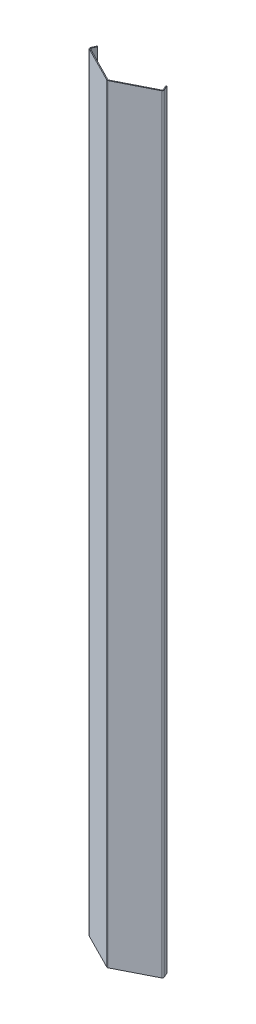
ISO-10303-21;
HEADER;
FILE_DESCRIPTION(('STEP AP214'),'2;1');
FILE_NAME('part.step','',(''),(''),'','','');
FILE_SCHEMA(('AUTOMOTIVE_DESIGN { 1 0 10303 214 1 1 1 1 }'));
ENDSEC;
DATA;
#1=APPLICATION_CONTEXT('core data for automotive mechanical design processes');
#2=APPLICATION_PROTOCOL_DEFINITION('international standard','automotive_design',2000,#1);
#3=PRODUCT_CONTEXT('',#1,'mechanical');
#4=PRODUCT('Part','Part','',(#3));
#5=PRODUCT_RELATED_PRODUCT_CATEGORY('part','',(#4));
#6=PRODUCT_DEFINITION_FORMATION('','',#4);
#7=PRODUCT_DEFINITION_CONTEXT('part definition',#1,'design');
#8=PRODUCT_DEFINITION('design','',#6,#7);
#9=PRODUCT_DEFINITION_SHAPE('','',#8);
#10=(LENGTH_UNIT() NAMED_UNIT(*) SI_UNIT(.MILLI.,.METRE.));
#11=(NAMED_UNIT(*) PLANE_ANGLE_UNIT() SI_UNIT($,.RADIAN.));
#12=(NAMED_UNIT(*) SI_UNIT($,.STERADIAN.) SOLID_ANGLE_UNIT());
#13=UNCERTAINTY_MEASURE_WITH_UNIT(LENGTH_MEASURE(1.E-05),#10,'distance_accuracy_value','');
#14=(GEOMETRIC_REPRESENTATION_CONTEXT(3) GLOBAL_UNCERTAINTY_ASSIGNED_CONTEXT((#13)) GLOBAL_UNIT_ASSIGNED_CONTEXT((#10,
#11,#12)) REPRESENTATION_CONTEXT('',''));
#15=CARTESIAN_POINT('',(0.,0.,0.));
#16=DIRECTION('',(0.,0.,1.));
#17=DIRECTION('',(1.,0.,0.));
#18=AXIS2_PLACEMENT_3D('',#15,#16,#17);
#19=CARTESIAN_POINT('',(314.661426322003,4665.,-132.916097269248));
#20=DIRECTION('',(0.409836101706061,0.,0.912159180043911));
#21=DIRECTION('',(0.912159180043911,0.,-0.409836101706061));
#22=AXIS2_PLACEMENT_3D('',#19,#20,#21);
#23=PLANE('',#22);
#24=DIRECTION('',(-0.912159180043911,0.,0.409836101706061));
#25=VECTOR('',#24,1.);
#26=CARTESIAN_POINT('',(314.661426322003,0.,-132.916097269248));
#27=LINE('',#26,#25);
#28=CARTESIAN_POINT('',(319.222222222222,0.,-134.965277777778));
#29=VERTEX_POINT('',#28);
#30=CARTESIAN_POINT('',(314.661426322003,0.,-132.916097269248));
#31=VERTEX_POINT('',#30);
#32=EDGE_CURVE('E176',#29,#31,#27,.T.);
#33=ORIENTED_EDGE('',*,*,#32,.T.);
#34=DIRECTION('',(0.,-1.,0.));
#35=VECTOR('',#34,1.);
#36=CARTESIAN_POINT('',(314.661426322003,4665.,-132.916097269248));
#37=LINE('',#36,#35);
#38=CARTESIAN_POINT('',(314.661426322003,4665.,-132.916097269248));
#39=VERTEX_POINT('',#38);
#40=EDGE_CURVE('E11',#39,#31,#37,.T.);
#41=ORIENTED_EDGE('',*,*,#40,.F.);
#42=DIRECTION('',(-0.912159180043911,0.,0.409836101706061));
#43=VECTOR('',#42,1.);
#44=CARTESIAN_POINT('',(314.661426322003,4665.,-132.916097269248));
#45=LINE('',#44,#43);
#46=CARTESIAN_POINT('',(319.222222222222,4665.,-134.965277777778));
#47=VERTEX_POINT('',#46);
#48=EDGE_CURVE('E206',#47,#39,#45,.T.);
#49=ORIENTED_EDGE('',*,*,#48,.F.);
#50=DIRECTION('',(0.,-1.,0.));
#51=VECTOR('',#50,1.);
#52=CARTESIAN_POINT('',(319.222222222222,4665.,-134.965277777778));
#53=LINE('',#52,#51);
#54=EDGE_CURVE('E172',#47,#29,#53,.T.);
#55=ORIENTED_EDGE('',*,*,#54,.T.);
#56=EDGE_LOOP('',(#33,#41,#49,#55));
#57=FACE_BOUND('',#56,.T.);
#58=ADVANCED_FACE('F32',(#57),#23,.F.);
#59=CARTESIAN_POINT('',(314.661426322003,4665.,-132.916097269248));
#60=DIRECTION('',(0.912159180043909,0.,-0.409836101706065));
#61=DIRECTION('',(-0.409836101706065,0.,-0.912159180043909));
#62=AXIS2_PLACEMENT_3D('',#59,#60,#61);
#63=PLANE('',#62);
#64=DIRECTION('',(0.409836101706065,0.,0.912159180043909));
#65=VECTOR('',#64,1.);
#66=CARTESIAN_POINT('',(314.661426322003,0.,-132.916097269248));
#67=LINE('',#66,#65);
#68=CARTESIAN_POINT('',(326.934062611785,0.,-105.601280911039));
#69=VERTEX_POINT('',#68);
#70=EDGE_CURVE('E179',#31,#69,#67,.T.);
#71=ORIENTED_EDGE('',*,*,#70,.T.);
#72=DIRECTION('',(0.,-1.,0.));
#73=VECTOR('',#72,1.);
#74=CARTESIAN_POINT('',(326.934062611785,4665.,-105.601280911039));
#75=LINE('',#74,#73);
#76=CARTESIAN_POINT('',(326.934062611785,4665.,-105.601280911039));
#77=VERTEX_POINT('',#76);
#78=EDGE_CURVE('E40',#77,#69,#75,.T.);
#79=ORIENTED_EDGE('',*,*,#78,.F.);
#80=DIRECTION('',(0.409836101706065,0.,0.912159180043909));
#81=VECTOR('',#80,1.);
#82=CARTESIAN_POINT('',(314.661426322003,4665.,-132.916097269248));
#83=LINE('',#82,#81);
#84=EDGE_CURVE('E115',#39,#77,#83,.T.);
#85=ORIENTED_EDGE('',*,*,#84,.F.);
#86=ORIENTED_EDGE('',*,*,#40,.T.);
#87=EDGE_LOOP('',(#71,#79,#85,#86));
#88=FACE_BOUND('',#87,.T.);
#89=ADVANCED_FACE('F304',(#88),#63,.F.);
#90=CARTESIAN_POINT('',(322.373266711566,4665.,-103.552100402509));
#91=DIRECTION('',(0.,-1.,0.));
#92=DIRECTION('',(0.,0.,-1.));
#93=AXIS2_PLACEMENT_3D('',#90,#91,#92);
#94=CYLINDRICAL_SURFACE('',#93,5.00000000000002);
#95=CARTESIAN_POINT('',(322.373266711566,0.,-103.552100402509));
#96=DIRECTION('',(0.,-1.,0.));
#97=DIRECTION('',(0.,0.,-1.));
#98=AXIS2_PLACEMENT_3D('',#95,#96,#97);
#99=CIRCLE('',#98,5.00000000000002);
#100=CARTESIAN_POINT('',(324.63301910157,0.,-99.0918852579371));
#101=VERTEX_POINT('',#100);
#102=EDGE_CURVE('E181',#69,#101,#99,.T.);
#103=ORIENTED_EDGE('',*,*,#102,.T.);
#104=DIRECTION('',(0.,-1.,0.));
#105=VECTOR('',#104,1.);
#106=CARTESIAN_POINT('',(324.63301910157,4665.,-99.0918852579371));
#107=LINE('',#106,#105);
#108=CARTESIAN_POINT('',(324.63301910157,4665.,-99.0918852579371));
#109=VERTEX_POINT('',#108);
#110=EDGE_CURVE('E237',#109,#101,#107,.T.);
#111=ORIENTED_EDGE('',*,*,#110,.F.);
#112=CARTESIAN_POINT('',(322.373266711566,4665.,-103.552100402509));
#113=DIRECTION('',(0.,-1.,0.));
#114=DIRECTION('',(0.,0.,-1.));
#115=AXIS2_PLACEMENT_3D('',#112,#113,#114);
#116=CIRCLE('',#115,5.00000000000002);
#117=EDGE_CURVE('E245',#77,#109,#116,.T.);
#118=ORIENTED_EDGE('',*,*,#117,.F.);
#119=ORIENTED_EDGE('',*,*,#78,.T.);
#120=EDGE_LOOP('',(#103,#111,#118,#119));
#121=FACE_BOUND('',#120,.T.);
#122=ADVANCED_FACE('F243',(#121),#94,.F.);
#123=CARTESIAN_POINT('',(110.450164903324,4665.,9.42310807406901));
#124=DIRECTION('',(0.451950478000949,0.,0.892043028914365));
#125=DIRECTION('',(0.892043028914365,0.,-0.451950478000949));
#126=AXIS2_PLACEMENT_3D('',#123,#124,#125);
#127=PLANE('',#126);
#128=DIRECTION('',(-0.892043028914365,0.,0.451950478000949));
#129=VECTOR('',#128,1.);
#130=CARTESIAN_POINT('',(110.450164903324,0.,9.42310807406901));
#131=LINE('',#130,#129);
#132=CARTESIAN_POINT('',(110.450164903324,0.,9.42310807406901));
#133=VERTEX_POINT('',#132);
#134=EDGE_CURVE('E183',#101,#133,#131,.T.);
#135=ORIENTED_EDGE('',*,*,#134,.T.);
#136=DIRECTION('',(0.,-1.,0.));
#137=VECTOR('',#136,1.);
#138=CARTESIAN_POINT('',(110.450164903324,4665.,9.42310807406901));
#139=LINE('',#138,#137);
#140=CARTESIAN_POINT('',(110.450164903324,4665.,9.42310807406901));
#141=VERTEX_POINT('',#140);
#142=EDGE_CURVE('E234',#141,#133,#139,.T.);
#143=ORIENTED_EDGE('',*,*,#142,.F.);
#144=DIRECTION('',(-0.892043028914365,0.,0.451950478000949));
#145=VECTOR('',#144,1.);
#146=CARTESIAN_POINT('',(110.450164903324,4665.,9.42310807406901));
#147=LINE('',#146,#145);
#148=EDGE_CURVE('E263',#109,#141,#147,.T.);
#149=ORIENTED_EDGE('',*,*,#148,.F.);
#150=ORIENTED_EDGE('',*,*,#110,.T.);
#151=EDGE_LOOP('',(#135,#143,#149,#150));
#152=FACE_BOUND('',#151,.T.);
#153=ADVANCED_FACE('F254',(#152),#127,.F.);
#154=CARTESIAN_POINT('',(108.19041251332,4665.,4.96289292949717));
#155=DIRECTION('',(0.,-1.,0.));
#156=DIRECTION('',(0.,0.,-1.));
#157=AXIS2_PLACEMENT_3D('',#154,#155,#156);
#158=CYLINDRICAL_SURFACE('',#157,5.00000000000001);
#159=CARTESIAN_POINT('',(108.19041251332,0.,4.96289292949717));
#160=DIRECTION('',(0.,-1.,0.));
#161=DIRECTION('',(0.,0.,1.));
#162=AXIS2_PLACEMENT_3D('',#159,#160,#161);
#163=CIRCLE('',#162,5.00000000000001);
#164=CARTESIAN_POINT('',(105.930660123315,0.,9.42310807406901));
#165=VERTEX_POINT('',#164);
#166=EDGE_CURVE('E185',#133,#165,#163,.T.);
#167=ORIENTED_EDGE('',*,*,#166,.T.);
#168=DIRECTION('',(0.,-1.,0.));
#169=VECTOR('',#168,1.);
#170=CARTESIAN_POINT('',(105.930660123315,4665.,9.42310807406901));
#171=LINE('',#170,#169);
#172=CARTESIAN_POINT('',(105.930660123315,4665.,9.42310807406901));
#173=VERTEX_POINT('',#172);
#174=EDGE_CURVE('E231',#173,#165,#171,.T.);
#175=ORIENTED_EDGE('',*,*,#174,.F.);
#176=CARTESIAN_POINT('',(108.19041251332,4665.,4.96289292949717));
#177=DIRECTION('',(0.,-1.,0.));
#178=DIRECTION('',(0.,0.,1.));
#179=AXIS2_PLACEMENT_3D('',#176,#177,#178);
#180=CIRCLE('',#179,5.00000000000001);
#181=EDGE_CURVE('E260',#141,#173,#180,.T.);
#182=ORIENTED_EDGE('',*,*,#181,.F.);
#183=ORIENTED_EDGE('',*,*,#142,.T.);
#184=EDGE_LOOP('',(#167,#175,#182,#183));
#185=FACE_BOUND('',#184,.T.);
#186=ADVANCED_FACE('F258',(#185),#158,.F.);
#187=CARTESIAN_POINT('',(105.930660123315,4665.,9.42310807406901));
#188=DIRECTION('',(-0.451950478000949,0.,0.892043028914365));
#189=DIRECTION('',(0.892043028914365,0.,0.451950478000949));
#190=AXIS2_PLACEMENT_3D('',#187,#188,#189);
#191=PLANE('',#190);
#192=DIRECTION('',(-0.892043028914365,0.,-0.451950478000949));
#193=VECTOR('',#192,1.);
#194=CARTESIAN_POINT('',(105.930660123315,0.,9.42310807406901));
#195=LINE('',#194,#193);
#196=CARTESIAN_POINT('',(-108.252194074931,0.,-99.0918852579371));
#197=VERTEX_POINT('',#196);
#198=EDGE_CURVE('E187',#165,#197,#195,.T.);
#199=ORIENTED_EDGE('',*,*,#198,.T.);
#200=DIRECTION('',(0.,-1.,0.));
#201=VECTOR('',#200,1.);
#202=CARTESIAN_POINT('',(-108.252194074931,4665.,-99.0918852579371));
#203=LINE('',#202,#201);
#204=CARTESIAN_POINT('',(-108.252194074931,4665.,-99.0918852579371));
#205=VERTEX_POINT('',#204);
#206=EDGE_CURVE('E228',#205,#197,#203,.T.);
#207=ORIENTED_EDGE('',*,*,#206,.F.);
#208=DIRECTION('',(-0.892043028914365,0.,-0.451950478000949));
#209=VECTOR('',#208,1.);
#210=CARTESIAN_POINT('',(105.930660123315,4665.,9.42310807406901));
#211=LINE('',#210,#209);
#212=EDGE_CURVE('E262',#173,#205,#211,.T.);
#213=ORIENTED_EDGE('',*,*,#212,.F.);
#214=ORIENTED_EDGE('',*,*,#174,.T.);
#215=EDGE_LOOP('',(#199,#207,#213,#214));
#216=FACE_BOUND('',#215,.T.);
#217=ADVANCED_FACE('F317',(#216),#191,.F.);
#218=CARTESIAN_POINT('',(-105.992441684927,4665.,-103.552100402509));
#219=DIRECTION('',(0.,-1.,0.));
#220=DIRECTION('',(0.,0.,-1.));
#221=AXIS2_PLACEMENT_3D('',#218,#219,#220);
#222=CYLINDRICAL_SURFACE('',#221,5.00000000000002);
#223=CARTESIAN_POINT('',(-105.992441684927,0.,-103.552100402509));
#224=DIRECTION('',(0.,-1.,0.));
#225=DIRECTION('',(0.,0.,1.));
#226=AXIS2_PLACEMENT_3D('',#223,#224,#225);
#227=CIRCLE('',#226,5.00000000000002);
#228=CARTESIAN_POINT('',(-110.553237585146,0.,-105.601280911039));
#229=VERTEX_POINT('',#228);
#230=EDGE_CURVE('E189',#197,#229,#227,.T.);
#231=ORIENTED_EDGE('',*,*,#230,.T.);
#232=DIRECTION('',(0.,-1.,0.));
#233=VECTOR('',#232,1.);
#234=CARTESIAN_POINT('',(-110.553237585146,4665.,-105.601280911039));
#235=LINE('',#234,#233);
#236=CARTESIAN_POINT('',(-110.553237585146,4665.,-105.601280911039));
#237=VERTEX_POINT('',#236);
#238=EDGE_CURVE('E225',#237,#229,#235,.T.);
#239=ORIENTED_EDGE('',*,*,#238,.F.);
#240=CARTESIAN_POINT('',(-105.992441684927,4665.,-103.552100402509));
#241=DIRECTION('',(0.,-1.,0.));
#242=DIRECTION('',(0.,0.,1.));
#243=AXIS2_PLACEMENT_3D('',#240,#241,#242);
#244=CIRCLE('',#243,5.00000000000002);
#245=EDGE_CURVE('E265',#205,#237,#244,.T.);
#246=ORIENTED_EDGE('',*,*,#245,.F.);
#247=ORIENTED_EDGE('',*,*,#206,.T.);
#248=EDGE_LOOP('',(#231,#239,#246,#247));
#249=FACE_BOUND('',#248,.T.);
#250=ADVANCED_FACE('F320',(#249),#222,.F.);
#251=CARTESIAN_POINT('',(-98.2806012953637,4665.,-132.916097269248));
#252=DIRECTION('',(-0.912159180043909,0.,-0.409836101706065));
#253=DIRECTION('',(-0.409836101706065,0.,0.912159180043909));
#254=AXIS2_PLACEMENT_3D('',#251,#252,#253);
#255=PLANE('',#254);
#256=DIRECTION('',(0.409836101706065,0.,-0.912159180043909));
#257=VECTOR('',#256,1.);
#258=CARTESIAN_POINT('',(-98.2806012953637,0.,-132.916097269248));
#259=LINE('',#258,#257);
#260=CARTESIAN_POINT('',(-98.2806012953637,0.,-132.916097269248));
#261=VERTEX_POINT('',#260);
#262=EDGE_CURVE('E191',#229,#261,#259,.T.);
#263=ORIENTED_EDGE('',*,*,#262,.T.);
#264=DIRECTION('',(0.,-1.,0.));
#265=VECTOR('',#264,1.);
#266=CARTESIAN_POINT('',(-98.2806012953637,4665.,-132.916097269248));
#267=LINE('',#266,#265);
#268=CARTESIAN_POINT('',(-98.2806012953637,4665.,-132.916097269248));
#269=VERTEX_POINT('',#268);
#270=EDGE_CURVE('E222',#269,#261,#267,.T.);
#271=ORIENTED_EDGE('',*,*,#270,.F.);
#272=DIRECTION('',(0.409836101706065,0.,-0.912159180043909));
#273=VECTOR('',#272,1.);
#274=CARTESIAN_POINT('',(-98.2806012953637,4665.,-132.916097269248));
#275=LINE('',#274,#273);
#276=EDGE_CURVE('E271',#237,#269,#275,.T.);
#277=ORIENTED_EDGE('',*,*,#276,.F.);
#278=ORIENTED_EDGE('',*,*,#238,.T.);
#279=EDGE_LOOP('',(#263,#271,#277,#278));
#280=FACE_BOUND('',#279,.T.);
#281=ADVANCED_FACE('F324',(#280),#255,.F.);
#282=CARTESIAN_POINT('',(-98.2806012953637,4665.,-132.916097269248));
#283=DIRECTION('',(-0.409836101706061,0.,0.912159180043911));
#284=DIRECTION('',(0.912159180043911,0.,0.409836101706061));
#285=AXIS2_PLACEMENT_3D('',#282,#283,#284);
#286=PLANE('',#285);
#287=DIRECTION('',(-0.912159180043911,0.,-0.409836101706061));
#288=VECTOR('',#287,1.);
#289=CARTESIAN_POINT('',(-98.2806012953637,0.,-132.916097269248));
#290=LINE('',#289,#288);
#291=CARTESIAN_POINT('',(-102.841397195583,0.,-134.965277777778));
#292=VERTEX_POINT('',#291);
#293=EDGE_CURVE('E193',#261,#292,#290,.T.);
#294=ORIENTED_EDGE('',*,*,#293,.T.);
#295=DIRECTION('',(0.,-1.,0.));
#296=VECTOR('',#295,1.);
#297=CARTESIAN_POINT('',(-102.841397195583,4665.,-134.965277777778));
#298=LINE('',#297,#296);
#299=CARTESIAN_POINT('',(-102.841397195583,4665.,-134.965277777778));
#300=VERTEX_POINT('',#299);
#301=EDGE_CURVE('E219',#300,#292,#298,.T.);
#302=ORIENTED_EDGE('',*,*,#301,.F.);
#303=DIRECTION('',(-0.912159180043911,0.,-0.409836101706061));
#304=VECTOR('',#303,1.);
#305=CARTESIAN_POINT('',(-98.2806012953637,4665.,-132.916097269248));
#306=LINE('',#305,#304);
#307=EDGE_CURVE('E273',#269,#300,#306,.T.);
#308=ORIENTED_EDGE('',*,*,#307,.F.);
#309=ORIENTED_EDGE('',*,*,#270,.T.);
#310=EDGE_LOOP('',(#294,#302,#308,#309));
#311=FACE_BOUND('',#310,.T.);
#312=ADVANCED_FACE('F328',(#311),#286,.F.);
#313=CARTESIAN_POINT('',(-102.841397195583,4665.,-134.965277777778));
#314=DIRECTION('',(0.91215918004391,0.,0.409836101706063));
#315=DIRECTION('',(0.409836101706063,0.,-0.91215918004391));
#316=AXIS2_PLACEMENT_3D('',#313,#314,#315);
#317=PLANE('',#316);
#318=DIRECTION('',(-0.409836101706063,0.,0.91215918004391));
#319=VECTOR('',#318,1.);
#320=CARTESIAN_POINT('',(-102.841397195583,0.,-134.965277777778));
#321=LINE('',#320,#319);
#322=CARTESIAN_POINT('',(-115.114033485366,0.,-107.65046141957));
#323=VERTEX_POINT('',#322);
#324=EDGE_CURVE('E195',#292,#323,#321,.T.);
#325=ORIENTED_EDGE('',*,*,#324,.T.);
#326=DIRECTION('',(0.,-1.,0.));
#327=VECTOR('',#326,1.);
#328=CARTESIAN_POINT('',(-115.114033485366,4665.,-107.65046141957));
#329=LINE('',#328,#327);
#330=CARTESIAN_POINT('',(-115.114033485366,4665.,-107.65046141957));
#331=VERTEX_POINT('',#330);
#332=EDGE_CURVE('E216',#331,#323,#329,.T.);
#333=ORIENTED_EDGE('',*,*,#332,.F.);
#334=DIRECTION('',(-0.409836101706063,0.,0.91215918004391));
#335=VECTOR('',#334,1.);
#336=CARTESIAN_POINT('',(-102.841397195583,4665.,-134.965277777778));
#337=LINE('',#336,#335);
#338=EDGE_CURVE('E275',#300,#331,#337,.T.);
#339=ORIENTED_EDGE('',*,*,#338,.F.);
#340=ORIENTED_EDGE('',*,*,#301,.T.);
#341=EDGE_LOOP('',(#325,#333,#339,#340));
#342=FACE_BOUND('',#341,.T.);
#343=ADVANCED_FACE('F332',(#342),#317,.F.);
#344=CARTESIAN_POINT('',(-105.992441684927,4665.,-103.552100402509));
#345=DIRECTION('',(0.,-1.,0.));
#346=DIRECTION('',(0.,0.,-1.));
#347=AXIS2_PLACEMENT_3D('',#344,#345,#346);
#348=CYLINDRICAL_SURFACE('',#347,10.);
#349=CARTESIAN_POINT('',(-105.992441684927,0.,-103.552100402509));
#350=DIRECTION('',(0.,1.,0.));
#351=DIRECTION('',(0.,0.,1.));
#352=AXIS2_PLACEMENT_3D('',#349,#350,#351);
#353=CIRCLE('',#352,10.);
#354=CARTESIAN_POINT('',(-110.511946464936,0.,-94.6316701133653));
#355=VERTEX_POINT('',#354);
#356=EDGE_CURVE('E197',#323,#355,#353,.T.);
#357=ORIENTED_EDGE('',*,*,#356,.T.);
#358=DIRECTION('',(0.,-1.,0.));
#359=VECTOR('',#358,1.);
#360=CARTESIAN_POINT('',(-110.511946464936,4665.,-94.6316701133653));
#361=LINE('',#360,#359);
#362=CARTESIAN_POINT('',(-110.511946464936,4665.,-94.6316701133653));
#363=VERTEX_POINT('',#362);
#364=EDGE_CURVE('E213',#363,#355,#361,.T.);
#365=ORIENTED_EDGE('',*,*,#364,.F.);
#366=CARTESIAN_POINT('',(-105.992441684927,4665.,-103.552100402509));
#367=DIRECTION('',(0.,1.,0.));
#368=DIRECTION('',(0.,0.,1.));
#369=AXIS2_PLACEMENT_3D('',#366,#367,#368);
#370=CIRCLE('',#369,10.);
#371=EDGE_CURVE('E277',#331,#363,#370,.T.);
#372=ORIENTED_EDGE('',*,*,#371,.F.);
#373=ORIENTED_EDGE('',*,*,#332,.T.);
#374=EDGE_LOOP('',(#357,#365,#372,#373));
#375=FACE_BOUND('',#374,.T.);
#376=ADVANCED_FACE('F336',(#375),#348,.T.);
#377=CARTESIAN_POINT('',(103.67090773331,4665.,13.8833232186408));
#378=DIRECTION('',(0.451950478000949,0.,-0.892043028914365));
#379=DIRECTION('',(-0.892043028914365,0.,-0.451950478000949));
#380=AXIS2_PLACEMENT_3D('',#377,#378,#379);
#381=PLANE('',#380);
#382=DIRECTION('',(0.892043028914365,0.,0.451950478000949));
#383=VECTOR('',#382,1.);
#384=CARTESIAN_POINT('',(103.67090773331,0.,13.8833232186408));
#385=LINE('',#384,#383);
#386=CARTESIAN_POINT('',(103.67090773331,0.,13.8833232186408));
#387=VERTEX_POINT('',#386);
#388=EDGE_CURVE('E199',#355,#387,#385,.T.);
#389=ORIENTED_EDGE('',*,*,#388,.T.);
#390=DIRECTION('',(0.,-1.,0.));
#391=VECTOR('',#390,1.);
#392=CARTESIAN_POINT('',(103.67090773331,4665.,13.8833232186408));
#393=LINE('',#392,#391);
#394=CARTESIAN_POINT('',(103.67090773331,4665.,13.8833232186408));
#395=VERTEX_POINT('',#394);
#396=EDGE_CURVE('E210',#395,#387,#393,.T.);
#397=ORIENTED_EDGE('',*,*,#396,.F.);
#398=DIRECTION('',(0.892043028914365,0.,0.451950478000949));
#399=VECTOR('',#398,1.);
#400=CARTESIAN_POINT('',(103.67090773331,4665.,13.8833232186408));
#401=LINE('',#400,#399);
#402=EDGE_CURVE('E279',#363,#395,#401,.T.);
#403=ORIENTED_EDGE('',*,*,#402,.F.);
#404=ORIENTED_EDGE('',*,*,#364,.T.);
#405=EDGE_LOOP('',(#389,#397,#403,#404));
#406=FACE_BOUND('',#405,.T.);
#407=ADVANCED_FACE('F285',(#406),#381,.F.);
#408=CARTESIAN_POINT('',(108.19041251332,4665.,4.96289292949717));
#409=DIRECTION('',(0.,-1.,0.));
#410=DIRECTION('',(0.,0.,-1.));
#411=AXIS2_PLACEMENT_3D('',#408,#409,#410);
#412=CYLINDRICAL_SURFACE('',#411,10.);
#413=CARTESIAN_POINT('',(108.19041251332,0.,4.96289292949717));
#414=DIRECTION('',(0.,1.,0.));
#415=DIRECTION('',(0.,0.,1.));
#416=AXIS2_PLACEMENT_3D('',#413,#414,#415);
#417=CIRCLE('',#416,10.);
#418=CARTESIAN_POINT('',(112.709917293329,0.,13.8833232186408));
#419=VERTEX_POINT('',#418);
#420=EDGE_CURVE('E201',#387,#419,#417,.T.);
#421=ORIENTED_EDGE('',*,*,#420,.T.);
#422=DIRECTION('',(0.,-1.,0.));
#423=VECTOR('',#422,1.);
#424=CARTESIAN_POINT('',(112.709917293329,4665.,13.8833232186408));
#425=LINE('',#424,#423);
#426=CARTESIAN_POINT('',(112.709917293329,4665.,13.8833232186408));
#427=VERTEX_POINT('',#426);
#428=EDGE_CURVE('E167',#427,#419,#425,.T.);
#429=ORIENTED_EDGE('',*,*,#428,.F.);
#430=CARTESIAN_POINT('',(108.19041251332,4665.,4.96289292949717));
#431=DIRECTION('',(0.,1.,0.));
#432=DIRECTION('',(0.,0.,1.));
#433=AXIS2_PLACEMENT_3D('',#430,#431,#432);
#434=CIRCLE('',#433,10.);
#435=EDGE_CURVE('E158',#395,#427,#434,.T.);
#436=ORIENTED_EDGE('',*,*,#435,.F.);
#437=ORIENTED_EDGE('',*,*,#396,.T.);
#438=EDGE_LOOP('',(#421,#429,#436,#437));
#439=FACE_BOUND('',#438,.T.);
#440=ADVANCED_FACE('F289',(#439),#412,.T.);
#441=CARTESIAN_POINT('',(112.709917293329,4665.,13.8833232186408));
#442=DIRECTION('',(-0.451950478000949,0.,-0.892043028914365));
#443=DIRECTION('',(-0.892043028914365,0.,0.451950478000949));
#444=AXIS2_PLACEMENT_3D('',#441,#442,#443);
#445=PLANE('',#444);
#446=DIRECTION('',(0.892043028914365,0.,-0.451950478000949));
#447=VECTOR('',#446,1.);
#448=CARTESIAN_POINT('',(112.709917293329,0.,13.8833232186408));
#449=LINE('',#448,#447);
#450=CARTESIAN_POINT('',(326.892771491575,0.,-94.6316701133653));
#451=VERTEX_POINT('',#450);
#452=EDGE_CURVE('E166',#419,#451,#449,.T.);
#453=ORIENTED_EDGE('',*,*,#452,.T.);
#454=DIRECTION('',(0.,-1.,0.));
#455=VECTOR('',#454,1.);
#456=CARTESIAN_POINT('',(326.892771491575,4665.,-94.6316701133653));
#457=LINE('',#456,#455);
#458=CARTESIAN_POINT('',(326.892771491575,4665.,-94.6316701133653));
#459=VERTEX_POINT('',#458);
#460=EDGE_CURVE('E163',#459,#451,#457,.T.);
#461=ORIENTED_EDGE('',*,*,#460,.F.);
#462=DIRECTION('',(0.892043028914365,0.,-0.451950478000949));
#463=VECTOR('',#462,1.);
#464=CARTESIAN_POINT('',(112.709917293329,4665.,13.8833232186408));
#465=LINE('',#464,#463);
#466=EDGE_CURVE('E152',#427,#459,#465,.T.);
#467=ORIENTED_EDGE('',*,*,#466,.F.);
#468=ORIENTED_EDGE('',*,*,#428,.T.);
#469=EDGE_LOOP('',(#453,#461,#467,#468));
#470=FACE_BOUND('',#469,.T.);
#471=ADVANCED_FACE('F164',(#470),#445,.F.);
#472=CARTESIAN_POINT('',(322.373266711566,4665.,-103.552100402509));
#473=DIRECTION('',(0.,-1.,0.));
#474=DIRECTION('',(0.,0.,-1.));
#475=AXIS2_PLACEMENT_3D('',#472,#473,#474);
#476=CYLINDRICAL_SURFACE('',#475,10.);
#477=CARTESIAN_POINT('',(322.373266711566,0.,-103.552100402509));
#478=DIRECTION('',(0.,1.,0.));
#479=DIRECTION('',(0.,0.,-1.));
#480=AXIS2_PLACEMENT_3D('',#477,#478,#479);
#481=CIRCLE('',#480,10.);
#482=CARTESIAN_POINT('',(331.494858512005,0.,-107.65046141957));
#483=VERTEX_POINT('',#482);
#484=EDGE_CURVE('E101',#451,#483,#481,.T.);
#485=ORIENTED_EDGE('',*,*,#484,.T.);
#486=DIRECTION('',(0.,-1.,0.));
#487=VECTOR('',#486,1.);
#488=CARTESIAN_POINT('',(331.494858512005,4665.,-107.65046141957));
#489=LINE('',#488,#487);
#490=CARTESIAN_POINT('',(331.494858512005,4665.,-107.65046141957));
#491=VERTEX_POINT('',#490);
#492=EDGE_CURVE('E168',#491,#483,#489,.T.);
#493=ORIENTED_EDGE('',*,*,#492,.F.);
#494=CARTESIAN_POINT('',(322.373266711566,4665.,-103.552100402509));
#495=DIRECTION('',(0.,1.,0.));
#496=DIRECTION('',(0.,0.,-1.));
#497=AXIS2_PLACEMENT_3D('',#494,#495,#496);
#498=CIRCLE('',#497,10.);
#499=EDGE_CURVE('E156',#459,#491,#498,.T.);
#500=ORIENTED_EDGE('',*,*,#499,.F.);
#501=ORIENTED_EDGE('',*,*,#460,.T.);
#502=EDGE_LOOP('',(#485,#493,#500,#501));
#503=FACE_BOUND('',#502,.T.);
#504=ADVANCED_FACE('F170',(#503),#476,.T.);
#505=CARTESIAN_POINT('',(319.222222222222,4665.,-134.965277777778));
#506=DIRECTION('',(-0.91215918004391,0.,0.409836101706063));
#507=DIRECTION('',(0.409836101706063,0.,0.91215918004391));
#508=AXIS2_PLACEMENT_3D('',#505,#506,#507);
#509=PLANE('',#508);
#510=DIRECTION('',(-0.409836101706063,0.,-0.91215918004391));
#511=VECTOR('',#510,1.);
#512=CARTESIAN_POINT('',(319.222222222222,0.,-134.965277777778));
#513=LINE('',#512,#511);
#514=EDGE_CURVE('E107',#483,#29,#513,.T.);
#515=ORIENTED_EDGE('',*,*,#514,.T.);
#516=ORIENTED_EDGE('',*,*,#54,.F.);
#517=DIRECTION('',(-0.409836101706063,0.,-0.91215918004391));
#518=VECTOR('',#517,1.);
#519=CARTESIAN_POINT('',(319.222222222222,4665.,-134.965277777778));
#520=LINE('',#519,#518);
#521=EDGE_CURVE('E48',#491,#47,#520,.T.);
#522=ORIENTED_EDGE('',*,*,#521,.F.);
#523=ORIENTED_EDGE('',*,*,#492,.T.);
#524=EDGE_LOOP('',(#515,#516,#522,#523));
#525=FACE_BOUND('',#524,.T.);
#526=ADVANCED_FACE('F293',(#525),#509,.F.);
#527=CARTESIAN_POINT('',(322.373266711566,4665.,-103.552100402509));
#528=DIRECTION('',(0.,-1.,0.));
#529=DIRECTION('',(0.,0.,-1.));
#530=AXIS2_PLACEMENT_3D('',#527,#528,#529);
#531=PLANE('',#530);
#532=ORIENTED_EDGE('',*,*,#48,.T.);
#533=ORIENTED_EDGE('',*,*,#84,.T.);
#534=ORIENTED_EDGE('',*,*,#117,.T.);
#535=ORIENTED_EDGE('',*,*,#148,.T.);
#536=ORIENTED_EDGE('',*,*,#181,.T.);
#537=ORIENTED_EDGE('',*,*,#212,.T.);
#538=ORIENTED_EDGE('',*,*,#245,.T.);
#539=ORIENTED_EDGE('',*,*,#276,.T.);
#540=ORIENTED_EDGE('',*,*,#307,.T.);
#541=ORIENTED_EDGE('',*,*,#338,.T.);
#542=ORIENTED_EDGE('',*,*,#371,.T.);
#543=ORIENTED_EDGE('',*,*,#402,.T.);
#544=ORIENTED_EDGE('',*,*,#435,.T.);
#545=ORIENTED_EDGE('',*,*,#466,.T.);
#546=ORIENTED_EDGE('',*,*,#499,.T.);
#547=ORIENTED_EDGE('',*,*,#521,.T.);
#548=EDGE_LOOP('',(#532,#533,#534,#535,#536,#537,#538,#539,#540,#541,#542,#543,#544,#545,#546,#547));
#549=FACE_BOUND('',#548,.T.);
#550=ADVANCED_FACE('F154',(#549),#531,.F.);
#551=CARTESIAN_POINT('',(322.373266711566,0.,-103.552100402509));
#552=DIRECTION('',(0.,-1.,0.));
#553=DIRECTION('',(0.,0.,-1.));
#554=AXIS2_PLACEMENT_3D('',#551,#552,#553);
#555=PLANE('',#554);
#556=ORIENTED_EDGE('',*,*,#32,.F.);
#557=ORIENTED_EDGE('',*,*,#514,.F.);
#558=ORIENTED_EDGE('',*,*,#484,.F.);
#559=ORIENTED_EDGE('',*,*,#452,.F.);
#560=ORIENTED_EDGE('',*,*,#420,.F.);
#561=ORIENTED_EDGE('',*,*,#388,.F.);
#562=ORIENTED_EDGE('',*,*,#356,.F.);
#563=ORIENTED_EDGE('',*,*,#324,.F.);
#564=ORIENTED_EDGE('',*,*,#293,.F.);
#565=ORIENTED_EDGE('',*,*,#262,.F.);
#566=ORIENTED_EDGE('',*,*,#230,.F.);
#567=ORIENTED_EDGE('',*,*,#198,.F.);
#568=ORIENTED_EDGE('',*,*,#166,.F.);
#569=ORIENTED_EDGE('',*,*,#134,.F.);
#570=ORIENTED_EDGE('',*,*,#102,.F.);
#571=ORIENTED_EDGE('',*,*,#70,.F.);
#572=EDGE_LOOP('',(#556,#557,#558,#559,#560,#561,#562,#563,#564,#565,#566,#567,#568,#569,#570,#571));
#573=FACE_BOUND('',#572,.T.);
#574=ADVANCED_FACE('F249',(#573),#555,.T.);
#575=CLOSED_SHELL('',(#58,#89,#122,#153,#186,#217,#250,#281,#312,#343,#376,#407,#440,#471,#504,
#526,#550,#574));
#576=MANIFOLD_SOLID_BREP('B2',#575);
#577=ADVANCED_BREP_SHAPE_REPRESENTATION('',(#18,#576),#14);
#578=SHAPE_DEFINITION_REPRESENTATION(#9,#577);
ENDSEC;
END-ISO-10303-21;
